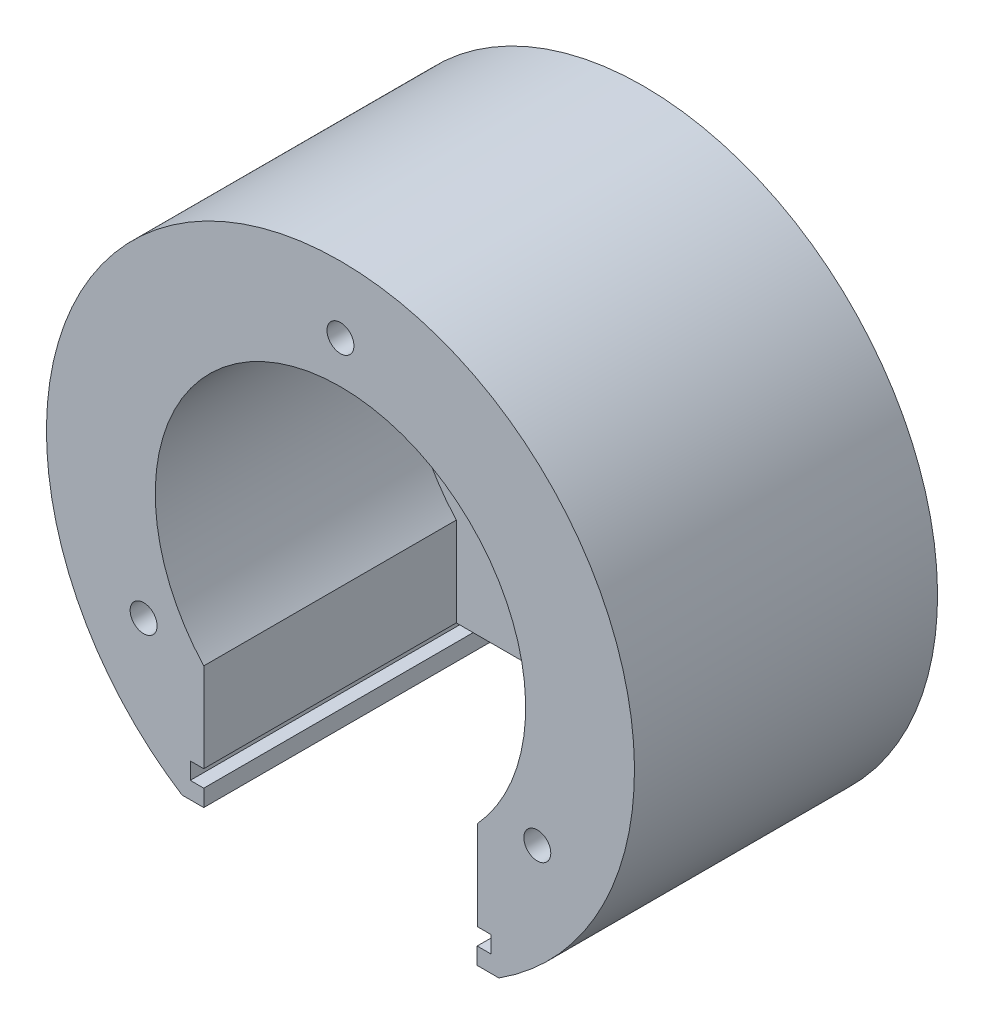
ISO-10303-21;
HEADER;
FILE_DESCRIPTION(('STEP AP214'),'2;1');
FILE_NAME('part.step','',(''),(''),'','','');
FILE_SCHEMA(('AUTOMOTIVE_DESIGN { 1 0 10303 214 1 1 1 1 }'));
ENDSEC;
DATA;
#1=APPLICATION_CONTEXT('core data for automotive mechanical design processes');
#2=APPLICATION_PROTOCOL_DEFINITION('international standard','automotive_design',2000,#1);
#3=PRODUCT_CONTEXT('',#1,'mechanical');
#4=PRODUCT('Part','Part','',(#3));
#5=PRODUCT_RELATED_PRODUCT_CATEGORY('part','',(#4));
#6=PRODUCT_DEFINITION_FORMATION('','',#4);
#7=PRODUCT_DEFINITION_CONTEXT('part definition',#1,'design');
#8=PRODUCT_DEFINITION('design','',#6,#7);
#9=PRODUCT_DEFINITION_SHAPE('','',#8);
#10=(LENGTH_UNIT() NAMED_UNIT(*) SI_UNIT(.MILLI.,.METRE.));
#11=(NAMED_UNIT(*) PLANE_ANGLE_UNIT() SI_UNIT($,.RADIAN.));
#12=(NAMED_UNIT(*) SI_UNIT($,.STERADIAN.) SOLID_ANGLE_UNIT());
#13=UNCERTAINTY_MEASURE_WITH_UNIT(LENGTH_MEASURE(1.E-05),#10,'distance_accuracy_value','');
#14=(GEOMETRIC_REPRESENTATION_CONTEXT(3) GLOBAL_UNCERTAINTY_ASSIGNED_CONTEXT((#13)) GLOBAL_UNIT_ASSIGNED_CONTEXT((#10,
#11,#12)) REPRESENTATION_CONTEXT('',''));
#15=CARTESIAN_POINT('',(0.,0.,0.));
#16=DIRECTION('',(0.,0.,1.));
#17=DIRECTION('',(1.,0.,0.));
#18=AXIS2_PLACEMENT_3D('',#15,#16,#17);
#19=CARTESIAN_POINT('',(0.,0.,18.));
#20=DIRECTION('',(0.,0.,-1.));
#21=DIRECTION('',(-1.,0.,0.));
#22=AXIS2_PLACEMENT_3D('',#19,#20,#21);
#23=CYLINDRICAL_SURFACE('',#22,17.4625);
#24=CARTESIAN_POINT('',(0.,0.,0.));
#25=DIRECTION('',(0.,0.,1.));
#26=DIRECTION('',(1.,0.,0.));
#27=AXIS2_PLACEMENT_3D('',#24,#25,#26);
#28=CIRCLE('',#27,17.4625);
#29=CARTESIAN_POINT('',(9.41035632959772,-14.71,0.));
#30=VERTEX_POINT('',#29);
#31=CARTESIAN_POINT('',(-9.41035632959772,-14.71,0.));
#32=VERTEX_POINT('',#31);
#33=EDGE_CURVE('E152',#30,#32,#28,.T.);
#34=ORIENTED_EDGE('',*,*,#33,.T.);
#35=DIRECTION('',(0.,0.,1.));
#36=VECTOR('',#35,1.);
#37=CARTESIAN_POINT('',(-9.41035632959772,-14.71,0.));
#38=LINE('',#37,#36);
#39=CARTESIAN_POINT('',(-9.41035632959772,-14.71,18.));
#40=VERTEX_POINT('',#39);
#41=EDGE_CURVE('E144',#32,#40,#38,.T.);
#42=ORIENTED_EDGE('',*,*,#41,.T.);
#43=CARTESIAN_POINT('',(0.,0.,18.));
#44=DIRECTION('',(0.,0.,1.));
#45=DIRECTION('',(1.,0.,0.));
#46=AXIS2_PLACEMENT_3D('',#43,#44,#45);
#47=CIRCLE('',#46,17.4625);
#48=CARTESIAN_POINT('',(9.41035632959772,-14.71,18.));
#49=VERTEX_POINT('',#48);
#50=EDGE_CURVE('E154',#49,#40,#47,.T.);
#51=ORIENTED_EDGE('',*,*,#50,.F.);
#52=DIRECTION('',(0.,0.,1.));
#53=VECTOR('',#52,1.);
#54=CARTESIAN_POINT('',(9.41035632959772,-14.71,0.));
#55=LINE('',#54,#53);
#56=EDGE_CURVE('E141',#30,#49,#55,.T.);
#57=ORIENTED_EDGE('',*,*,#56,.F.);
#58=EDGE_LOOP('',(#34,#42,#51,#57));
#59=FACE_BOUND('',#58,.T.);
#60=ADVANCED_FACE('F41',(#59),#23,.T.);
#61=CARTESIAN_POINT('',(0.,0.,18.));
#62=DIRECTION('',(0.,0.,1.));
#63=DIRECTION('',(1.,0.,0.));
#64=AXIS2_PLACEMENT_3D('',#61,#62,#63);
#65=PLANE('',#64);
#66=DIRECTION('',(-1.,0.,0.));
#67=VECTOR('',#66,1.);
#68=CARTESIAN_POINT('',(-9.41035632959772,-14.71,18.));
#69=LINE('',#68,#67);
#70=CARTESIAN_POINT('',(8.11956318098455,-14.71,18.));
#71=VERTEX_POINT('',#70);
#72=EDGE_CURVE('E148',#49,#71,#69,.T.);
#73=ORIENTED_EDGE('',*,*,#72,.F.);
#74=ORIENTED_EDGE('',*,*,#50,.T.);
#75=CARTESIAN_POINT('',(-8.11956318098455,-14.71,18.));
#76=VERTEX_POINT('',#75);
#77=EDGE_CURVE('E565',#76,#40,#69,.T.);
#78=ORIENTED_EDGE('',*,*,#77,.F.);
#79=DIRECTION('',(0.,-1.,0.));
#80=VECTOR('',#79,1.);
#81=CARTESIAN_POINT('',(-8.11956318098455,-13.71,18.));
#82=LINE('',#81,#80);
#83=CARTESIAN_POINT('',(-8.11956318098455,-13.71,18.));
#84=VERTEX_POINT('',#83);
#85=EDGE_CURVE('E518',#84,#76,#82,.T.);
#86=ORIENTED_EDGE('',*,*,#85,.F.);
#87=DIRECTION('',(1.,0.,0.));
#88=VECTOR('',#87,1.);
#89=CARTESIAN_POINT('',(-8.91956318098455,-13.71,18.));
#90=LINE('',#89,#88);
#91=CARTESIAN_POINT('',(-8.91956318098455,-13.71,18.));
#92=VERTEX_POINT('',#91);
#93=EDGE_CURVE('E515',#92,#84,#90,.T.);
#94=ORIENTED_EDGE('',*,*,#93,.F.);
#95=DIRECTION('',(0.,-1.,0.));
#96=VECTOR('',#95,1.);
#97=CARTESIAN_POINT('',(-8.91956318098455,-13.71,18.));
#98=LINE('',#97,#96);
#99=CARTESIAN_POINT('',(-8.91956318098455,-12.71,18.));
#100=VERTEX_POINT('',#99);
#101=EDGE_CURVE('E512',#100,#92,#98,.T.);
#102=ORIENTED_EDGE('',*,*,#101,.F.);
#103=DIRECTION('',(-1.,0.,0.));
#104=VECTOR('',#103,1.);
#105=CARTESIAN_POINT('',(-8.91956318098455,-12.71,18.));
#106=LINE('',#105,#104);
#107=CARTESIAN_POINT('',(-8.11956318098455,-12.71,18.));
#108=VERTEX_POINT('',#107);
#109=EDGE_CURVE('E529',#108,#100,#106,.T.);
#110=ORIENTED_EDGE('',*,*,#109,.F.);
#111=DIRECTION('',(0.,-1.,0.));
#112=VECTOR('',#111,1.);
#113=CARTESIAN_POINT('',(-8.11956318098455,-6.75863679021441,18.));
#114=LINE('',#113,#112);
#115=CARTESIAN_POINT('',(-8.11956318098455,-7.42109788036784,18.));
#116=VERTEX_POINT('',#115);
#117=EDGE_CURVE('E181',#116,#108,#114,.T.);
#118=ORIENTED_EDGE('',*,*,#117,.F.);
#119=CARTESIAN_POINT('',(0.,0.,18.));
#120=DIRECTION('',(0.,0.,1.));
#121=DIRECTION('',(1.,0.,0.));
#122=AXIS2_PLACEMENT_3D('',#119,#120,#121);
#123=CIRCLE('',#122,11.);
#124=CARTESIAN_POINT('',(8.13043681901545,-7.4091832972331,18.));
#125=VERTEX_POINT('',#124);
#126=EDGE_CURVE('E180',#125,#116,#123,.T.);
#127=ORIENTED_EDGE('',*,*,#126,.F.);
#128=DIRECTION('',(0.,1.,0.));
#129=VECTOR('',#128,1.);
#130=CARTESIAN_POINT('',(8.13043681901545,-6.75863679021441,18.));
#131=LINE('',#130,#129);
#132=CARTESIAN_POINT('',(8.13043681901545,-12.71,18.));
#133=VERTEX_POINT('',#132);
#134=EDGE_CURVE('E169',#133,#125,#131,.T.);
#135=ORIENTED_EDGE('',*,*,#134,.F.);
#136=CARTESIAN_POINT('',(8.93043681901545,-12.71,18.));
#137=VERTEX_POINT('',#136);
#138=EDGE_CURVE('E62',#137,#133,#106,.T.);
#139=ORIENTED_EDGE('',*,*,#138,.F.);
#140=DIRECTION('',(0.,1.,0.));
#141=VECTOR('',#140,1.);
#142=CARTESIAN_POINT('',(8.93043681901545,-12.71,18.));
#143=LINE('',#142,#141);
#144=CARTESIAN_POINT('',(8.93043681901545,-13.71,18.));
#145=VERTEX_POINT('',#144);
#146=EDGE_CURVE('E526',#145,#137,#143,.T.);
#147=ORIENTED_EDGE('',*,*,#146,.F.);
#148=DIRECTION('',(1.,0.,0.));
#149=VECTOR('',#148,1.);
#150=CARTESIAN_POINT('',(8.93043681901545,-13.71,18.));
#151=LINE('',#150,#149);
#152=CARTESIAN_POINT('',(8.11956318098455,-13.71,18.));
#153=VERTEX_POINT('',#152);
#154=EDGE_CURVE('E523',#153,#145,#151,.T.);
#155=ORIENTED_EDGE('',*,*,#154,.F.);
#156=DIRECTION('',(0.,1.,0.));
#157=VECTOR('',#156,1.);
#158=CARTESIAN_POINT('',(8.11956318098455,-15.46,18.));
#159=LINE('',#158,#157);
#160=EDGE_CURVE('E521',#71,#153,#159,.T.);
#161=ORIENTED_EDGE('',*,*,#160,.F.);
#162=EDGE_LOOP('',(#73,#74,#78,#86,#94,#102,#110,#118,#127,#135,#139,#147,#155,#161));
#163=FACE_BOUND('',#162,.T.);
#164=CARTESIAN_POINT('',(6.12383107306205E-13,13.5,18.));
#165=DIRECTION('',(0.,0.,1.));
#166=DIRECTION('',(1.,0.,0.));
#167=AXIS2_PLACEMENT_3D('',#164,#165,#166);
#168=CIRCLE('',#167,0.8);
#169=CARTESIAN_POINT('',(0.800000000000613,13.5,18.));
#170=VERTEX_POINT('',#169);
#171=EDGE_CURVE('E161',#170,#170,#168,.T.);
#172=ORIENTED_EDGE('',*,*,#171,.F.);
#173=EDGE_LOOP('',(#172));
#174=FACE_BOUND('',#173,.T.);
#175=CARTESIAN_POINT('',(11.6913429510902,-6.7500000000002,18.));
#176=DIRECTION('',(0.,0.,1.));
#177=DIRECTION('',(1.,0.,0.));
#178=AXIS2_PLACEMENT_3D('',#175,#176,#177);
#179=CIRCLE('',#178,0.800000000000001);
#180=CARTESIAN_POINT('',(12.4913429510902,-6.7500000000002,18.));
#181=VERTEX_POINT('',#180);
#182=EDGE_CURVE('E202',#181,#181,#179,.T.);
#183=ORIENTED_EDGE('',*,*,#182,.F.);
#184=EDGE_LOOP('',(#183));
#185=FACE_BOUND('',#184,.T.);
#186=CARTESIAN_POINT('',(-11.6913429510897,-6.74999999999979,18.));
#187=DIRECTION('',(0.,0.,1.));
#188=DIRECTION('',(1.,0.,0.));
#189=AXIS2_PLACEMENT_3D('',#186,#187,#188);
#190=CIRCLE('',#189,0.800000000000001);
#191=CARTESIAN_POINT('',(-10.8913429510897,-6.74999999999979,18.));
#192=VERTEX_POINT('',#191);
#193=EDGE_CURVE('E208',#192,#192,#190,.T.);
#194=ORIENTED_EDGE('',*,*,#193,.F.);
#195=EDGE_LOOP('',(#194));
#196=FACE_BOUND('',#195,.T.);
#197=ADVANCED_FACE('F175',(#163,#174,#185,#196),#65,.T.);
#198=CARTESIAN_POINT('',(0.,0.,0.));
#199=DIRECTION('',(0.,0.,1.));
#200=DIRECTION('',(1.,0.,0.));
#201=AXIS2_PLACEMENT_3D('',#198,#199,#200);
#202=PLANE('',#201);
#203=ORIENTED_EDGE('',*,*,#33,.F.);
#204=DIRECTION('',(-1.,0.,0.));
#205=VECTOR('',#204,1.);
#206=CARTESIAN_POINT('',(-9.41035632959772,-14.71,0.));
#207=LINE('',#206,#205);
#208=EDGE_CURVE('E138',#30,#32,#207,.T.);
#209=ORIENTED_EDGE('',*,*,#208,.T.);
#210=EDGE_LOOP('',(#203,#209));
#211=FACE_BOUND('',#210,.T.);
#212=ADVANCED_FACE('F156',(#211),#202,.F.);
#213=CARTESIAN_POINT('',(-11.6913429510897,-6.74999999999979,10.7));
#214=DIRECTION('',(0.,0.,1.));
#215=DIRECTION('',(1.,0.,0.));
#216=AXIS2_PLACEMENT_3D('',#213,#214,#215);
#217=CYLINDRICAL_SURFACE('',#216,0.800000000000001);
#218=CARTESIAN_POINT('',(-11.6913429510897,-6.74999999999979,10.7));
#219=DIRECTION('',(0.,0.,1.));
#220=DIRECTION('',(1.,0.,0.));
#221=AXIS2_PLACEMENT_3D('',#218,#219,#220);
#222=CIRCLE('',#221,0.800000000000001);
#223=CARTESIAN_POINT('',(-10.8913429510897,-6.74999999999979,10.7));
#224=VERTEX_POINT('',#223);
#225=EDGE_CURVE('E198',#224,#224,#222,.T.);
#226=ORIENTED_EDGE('',*,*,#225,.F.);
#227=EDGE_LOOP('',(#226));
#228=FACE_BOUND('',#227,.T.);
#229=ORIENTED_EDGE('',*,*,#193,.T.);
#230=EDGE_LOOP('',(#229));
#231=FACE_BOUND('',#230,.T.);
#232=ADVANCED_FACE('F215',(#228,#231),#217,.F.);
#233=CARTESIAN_POINT('',(-11.6913429510897,-6.74999999999979,10.7));
#234=DIRECTION('',(0.,0.,1.));
#235=DIRECTION('',(1.,0.,0.));
#236=AXIS2_PLACEMENT_3D('',#233,#234,#235);
#237=PLANE('',#236);
#238=ORIENTED_EDGE('',*,*,#225,.T.);
#239=EDGE_LOOP('',(#238));
#240=FACE_BOUND('',#239,.T.);
#241=ADVANCED_FACE('F213',(#240),#237,.T.);
#242=CARTESIAN_POINT('',(11.6913429510902,-6.7500000000002,10.7));
#243=DIRECTION('',(0.,0.,1.));
#244=DIRECTION('',(1.,0.,0.));
#245=AXIS2_PLACEMENT_3D('',#242,#243,#244);
#246=CYLINDRICAL_SURFACE('',#245,0.800000000000001);
#247=CARTESIAN_POINT('',(11.6913429510902,-6.7500000000002,10.7));
#248=DIRECTION('',(0.,0.,1.));
#249=DIRECTION('',(1.,0.,0.));
#250=AXIS2_PLACEMENT_3D('',#247,#248,#249);
#251=CIRCLE('',#250,0.800000000000001);
#252=CARTESIAN_POINT('',(12.4913429510902,-6.7500000000002,10.7));
#253=VERTEX_POINT('',#252);
#254=EDGE_CURVE('E205',#253,#253,#251,.T.);
#255=ORIENTED_EDGE('',*,*,#254,.F.);
#256=EDGE_LOOP('',(#255));
#257=FACE_BOUND('',#256,.T.);
#258=ORIENTED_EDGE('',*,*,#182,.T.);
#259=EDGE_LOOP('',(#258));
#260=FACE_BOUND('',#259,.T.);
#261=ADVANCED_FACE('F229',(#257,#260),#246,.F.);
#262=CARTESIAN_POINT('',(11.6913429510902,-6.7500000000002,10.7));
#263=DIRECTION('',(0.,0.,1.));
#264=DIRECTION('',(1.,0.,0.));
#265=AXIS2_PLACEMENT_3D('',#262,#263,#264);
#266=PLANE('',#265);
#267=ORIENTED_EDGE('',*,*,#254,.T.);
#268=EDGE_LOOP('',(#267));
#269=FACE_BOUND('',#268,.T.);
#270=ADVANCED_FACE('F231',(#269),#266,.T.);
#271=CARTESIAN_POINT('',(6.12383107306205E-13,13.5,10.7));
#272=DIRECTION('',(0.,0.,1.));
#273=DIRECTION('',(1.,0.,0.));
#274=AXIS2_PLACEMENT_3D('',#271,#272,#273);
#275=CYLINDRICAL_SURFACE('',#274,0.8);
#276=CARTESIAN_POINT('',(6.12383107306205E-13,13.5,10.7));
#277=DIRECTION('',(0.,0.,1.));
#278=DIRECTION('',(1.,0.,0.));
#279=AXIS2_PLACEMENT_3D('',#276,#277,#278);
#280=CIRCLE('',#279,0.8);
#281=CARTESIAN_POINT('',(0.800000000000613,13.5,10.7));
#282=VERTEX_POINT('',#281);
#283=EDGE_CURVE('E157',#282,#282,#280,.T.);
#284=ORIENTED_EDGE('',*,*,#283,.F.);
#285=EDGE_LOOP('',(#284));
#286=FACE_BOUND('',#285,.T.);
#287=ORIENTED_EDGE('',*,*,#171,.T.);
#288=EDGE_LOOP('',(#287));
#289=FACE_BOUND('',#288,.T.);
#290=ADVANCED_FACE('F234',(#286,#289),#275,.F.);
#291=CARTESIAN_POINT('',(6.12383107306205E-13,13.5,10.7));
#292=DIRECTION('',(0.,0.,1.));
#293=DIRECTION('',(1.,0.,0.));
#294=AXIS2_PLACEMENT_3D('',#291,#292,#293);
#295=PLANE('',#294);
#296=ORIENTED_EDGE('',*,*,#283,.T.);
#297=EDGE_LOOP('',(#296));
#298=FACE_BOUND('',#297,.T.);
#299=ADVANCED_FACE('F241',(#298),#295,.T.);
#300=CARTESIAN_POINT('',(0.,0.,3.));
#301=DIRECTION('',(0.,0.,1.));
#302=DIRECTION('',(1.,0.,0.));
#303=AXIS2_PLACEMENT_3D('',#300,#301,#302);
#304=CYLINDRICAL_SURFACE('',#303,11.);
#305=ORIENTED_EDGE('',*,*,#126,.T.);
#306=DIRECTION('',(0.,0.,1.));
#307=VECTOR('',#306,1.);
#308=CARTESIAN_POINT('',(-8.11956318098455,-7.42109788036784,3.));
#309=LINE('',#308,#307);
#310=CARTESIAN_POINT('',(-8.11956318098455,-7.42109788036784,3.));
#311=VERTEX_POINT('',#310);
#312=EDGE_CURVE('E192',#116,#311,#309,.F.);
#313=ORIENTED_EDGE('',*,*,#312,.T.);
#314=CARTESIAN_POINT('',(0.,0.,3.));
#315=DIRECTION('',(0.,0.,1.));
#316=DIRECTION('',(1.,0.,0.));
#317=AXIS2_PLACEMENT_3D('',#314,#315,#316);
#318=CIRCLE('',#317,11.);
#319=CARTESIAN_POINT('',(8.13043681901545,-7.4091832972331,3.));
#320=VERTEX_POINT('',#319);
#321=EDGE_CURVE('E195',#320,#311,#318,.T.);
#322=ORIENTED_EDGE('',*,*,#321,.F.);
#323=DIRECTION('',(0.,0.,1.));
#324=VECTOR('',#323,1.);
#325=CARTESIAN_POINT('',(8.13043681901545,-7.4091832972331,3.));
#326=LINE('',#325,#324);
#327=EDGE_CURVE('E190',#320,#125,#326,.T.);
#328=ORIENTED_EDGE('',*,*,#327,.T.);
#329=EDGE_LOOP('',(#305,#313,#322,#328));
#330=FACE_BOUND('',#329,.T.);
#331=ADVANCED_FACE('F245',(#330),#304,.F.);
#332=CARTESIAN_POINT('',(0.,0.,3.));
#333=DIRECTION('',(0.,0.,1.));
#334=DIRECTION('',(1.,0.,0.));
#335=AXIS2_PLACEMENT_3D('',#332,#333,#334);
#336=PLANE('',#335);
#337=DIRECTION('',(-1.,0.,0.));
#338=VECTOR('',#337,1.);
#339=CARTESIAN_POINT('',(0.,-12.71,3.));
#340=LINE('',#339,#338);
#341=CARTESIAN_POINT('',(8.13043681901545,-12.71,3.));
#342=VERTEX_POINT('',#341);
#343=CARTESIAN_POINT('',(-8.11956318098455,-12.71,3.));
#344=VERTEX_POINT('',#343);
#345=EDGE_CURVE('E534',#342,#344,#340,.T.);
#346=ORIENTED_EDGE('',*,*,#345,.F.);
#347=DIRECTION('',(0.,-1.,0.));
#348=VECTOR('',#347,1.);
#349=CARTESIAN_POINT('',(8.13043681901545,-6.75863679021441,3.));
#350=LINE('',#349,#348);
#351=EDGE_CURVE('E171',#320,#342,#350,.T.);
#352=ORIENTED_EDGE('',*,*,#351,.F.);
#353=ORIENTED_EDGE('',*,*,#321,.T.);
#354=DIRECTION('',(0.,1.,0.));
#355=VECTOR('',#354,1.);
#356=CARTESIAN_POINT('',(-8.11956318098455,-6.75863679021441,3.));
#357=LINE('',#356,#355);
#358=EDGE_CURVE('E183',#344,#311,#357,.T.);
#359=ORIENTED_EDGE('',*,*,#358,.F.);
#360=EDGE_LOOP('',(#346,#352,#353,#359));
#361=FACE_BOUND('',#360,.T.);
#362=ADVANCED_FACE('F249',(#361),#336,.T.);
#363=CARTESIAN_POINT('',(-8.11956318098455,-6.75863679021441,-14.5775643611243));
#364=DIRECTION('',(-1.,0.,0.));
#365=DIRECTION('',(0.,-1.,0.));
#366=AXIS2_PLACEMENT_3D('',#363,#364,#365);
#367=PLANE('',#366);
#368=ORIENTED_EDGE('',*,*,#117,.T.);
#369=DIRECTION('',(0.,0.,-1.));
#370=VECTOR('',#369,1.);
#371=CARTESIAN_POINT('',(-8.11956318098455,-12.71,-14.5775643611243));
#372=LINE('',#371,#370);
#373=EDGE_CURVE('E186',#108,#344,#372,.T.);
#374=ORIENTED_EDGE('',*,*,#373,.T.);
#375=ORIENTED_EDGE('',*,*,#358,.T.);
#376=ORIENTED_EDGE('',*,*,#312,.F.);
#377=EDGE_LOOP('',(#368,#374,#375,#376));
#378=FACE_BOUND('',#377,.T.);
#379=ADVANCED_FACE('F253',(#378),#367,.F.);
#380=CARTESIAN_POINT('',(8.13043681901545,-6.75863679021441,-14.5775643611243));
#381=DIRECTION('',(1.,0.,0.));
#382=DIRECTION('',(0.,1.,0.));
#383=AXIS2_PLACEMENT_3D('',#380,#381,#382);
#384=PLANE('',#383);
#385=ORIENTED_EDGE('',*,*,#351,.T.);
#386=DIRECTION('',(0.,0.,1.));
#387=VECTOR('',#386,1.);
#388=CARTESIAN_POINT('',(8.13043681901545,-12.71,-14.5775643611243));
#389=LINE('',#388,#387);
#390=EDGE_CURVE('E48',#342,#133,#389,.T.);
#391=ORIENTED_EDGE('',*,*,#390,.T.);
#392=ORIENTED_EDGE('',*,*,#134,.T.);
#393=ORIENTED_EDGE('',*,*,#327,.F.);
#394=EDGE_LOOP('',(#385,#391,#392,#393));
#395=FACE_BOUND('',#394,.T.);
#396=ADVANCED_FACE('F167',(#395),#384,.F.);
#397=CARTESIAN_POINT('',(-8.91956318098455,-12.71,0.999999999999997));
#398=DIRECTION('',(0.,1.,0.));
#399=DIRECTION('',(0.,0.,1.));
#400=AXIS2_PLACEMENT_3D('',#397,#398,#399);
#401=PLANE('',#400);
#402=ORIENTED_EDGE('',*,*,#109,.T.);
#403=DIRECTION('',(0.,0.,1.));
#404=VECTOR('',#403,1.);
#405=CARTESIAN_POINT('',(-8.91956318098455,-12.71,0.999999999999997));
#406=LINE('',#405,#404);
#407=CARTESIAN_POINT('',(-8.91956318098455,-12.71,0.999999999999997));
#408=VERTEX_POINT('',#407);
#409=EDGE_CURVE('E531',#408,#100,#406,.T.);
#410=ORIENTED_EDGE('',*,*,#409,.F.);
#411=DIRECTION('',(-1.,0.,0.));
#412=VECTOR('',#411,1.);
#413=CARTESIAN_POINT('',(-8.91956318098455,-12.71,0.999999999999997));
#414=LINE('',#413,#412);
#415=CARTESIAN_POINT('',(8.93043681901545,-12.71,0.999999999999997));
#416=VERTEX_POINT('',#415);
#417=EDGE_CURVE('E508',#416,#408,#414,.T.);
#418=ORIENTED_EDGE('',*,*,#417,.F.);
#419=DIRECTION('',(0.,0.,1.));
#420=VECTOR('',#419,1.);
#421=CARTESIAN_POINT('',(8.93043681901545,-12.71,0.999999999999997));
#422=LINE('',#421,#420);
#423=EDGE_CURVE('E535',#416,#137,#422,.T.);
#424=ORIENTED_EDGE('',*,*,#423,.T.);
#425=ORIENTED_EDGE('',*,*,#138,.T.);
#426=ORIENTED_EDGE('',*,*,#390,.F.);
#427=ORIENTED_EDGE('',*,*,#345,.T.);
#428=ORIENTED_EDGE('',*,*,#373,.F.);
#429=EDGE_LOOP('',(#402,#410,#418,#424,#425,#426,#427,#428));
#430=FACE_BOUND('',#429,.T.);
#431=ADVANCED_FACE('F260',(#430),#401,.F.);
#432=CARTESIAN_POINT('',(-8.91956318098455,-13.71,0.999999999999997));
#433=DIRECTION('',(-1.,0.,0.));
#434=DIRECTION('',(0.,0.,1.));
#435=AXIS2_PLACEMENT_3D('',#432,#433,#434);
#436=PLANE('',#435);
#437=ORIENTED_EDGE('',*,*,#101,.T.);
#438=DIRECTION('',(0.,0.,1.));
#439=VECTOR('',#438,1.);
#440=CARTESIAN_POINT('',(-8.91956318098455,-13.71,0.999999999999997));
#441=LINE('',#440,#439);
#442=CARTESIAN_POINT('',(-8.91956318098455,-13.71,0.999999999999997));
#443=VERTEX_POINT('',#442);
#444=EDGE_CURVE('E511',#443,#92,#441,.T.);
#445=ORIENTED_EDGE('',*,*,#444,.F.);
#446=DIRECTION('',(0.,-1.,0.));
#447=VECTOR('',#446,1.);
#448=CARTESIAN_POINT('',(-8.91956318098455,-13.71,0.999999999999997));
#449=LINE('',#448,#447);
#450=EDGE_CURVE('E499',#408,#443,#449,.T.);
#451=ORIENTED_EDGE('',*,*,#450,.F.);
#452=ORIENTED_EDGE('',*,*,#409,.T.);
#453=EDGE_LOOP('',(#437,#445,#451,#452));
#454=FACE_BOUND('',#453,.T.);
#455=ADVANCED_FACE('F261',(#454),#436,.F.);
#456=CARTESIAN_POINT('',(8.93043681901545,-12.71,0.999999999999997));
#457=DIRECTION('',(1.,0.,0.));
#458=DIRECTION('',(0.,0.,-1.));
#459=AXIS2_PLACEMENT_3D('',#456,#457,#458);
#460=PLANE('',#459);
#461=ORIENTED_EDGE('',*,*,#146,.T.);
#462=ORIENTED_EDGE('',*,*,#423,.F.);
#463=DIRECTION('',(0.,1.,0.));
#464=VECTOR('',#463,1.);
#465=CARTESIAN_POINT('',(8.93043681901545,-12.71,0.999999999999997));
#466=LINE('',#465,#464);
#467=CARTESIAN_POINT('',(8.93043681901545,-13.71,0.999999999999997));
#468=VERTEX_POINT('',#467);
#469=EDGE_CURVE('E505',#468,#416,#466,.T.);
#470=ORIENTED_EDGE('',*,*,#469,.F.);
#471=DIRECTION('',(0.,0.,1.));
#472=VECTOR('',#471,1.);
#473=CARTESIAN_POINT('',(8.93043681901545,-13.71,0.999999999999997));
#474=LINE('',#473,#472);
#475=EDGE_CURVE('E537',#468,#145,#474,.T.);
#476=ORIENTED_EDGE('',*,*,#475,.T.);
#477=EDGE_LOOP('',(#461,#462,#470,#476));
#478=FACE_BOUND('',#477,.T.);
#479=ADVANCED_FACE('F264',(#478),#460,.F.);
#480=CARTESIAN_POINT('',(8.93043681901545,-13.71,0.999999999999997));
#481=DIRECTION('',(0.,-1.,0.));
#482=DIRECTION('',(0.,0.,-1.));
#483=AXIS2_PLACEMENT_3D('',#480,#481,#482);
#484=PLANE('',#483);
#485=ORIENTED_EDGE('',*,*,#154,.T.);
#486=ORIENTED_EDGE('',*,*,#475,.F.);
#487=DIRECTION('',(1.,0.,0.));
#488=VECTOR('',#487,1.);
#489=CARTESIAN_POINT('',(8.93043681901545,-13.71,0.999999999999997));
#490=LINE('',#489,#488);
#491=CARTESIAN_POINT('',(8.11956318098455,-13.71,0.999999999999997));
#492=VERTEX_POINT('',#491);
#493=EDGE_CURVE('E497',#492,#468,#490,.T.);
#494=ORIENTED_EDGE('',*,*,#493,.F.);
#495=DIRECTION('',(0.,0.,1.));
#496=VECTOR('',#495,1.);
#497=CARTESIAN_POINT('',(8.11956318098455,-13.71,0.999999999999997));
#498=LINE('',#497,#496);
#499=EDGE_CURVE('E539',#492,#153,#498,.T.);
#500=ORIENTED_EDGE('',*,*,#499,.T.);
#501=EDGE_LOOP('',(#485,#486,#494,#500));
#502=FACE_BOUND('',#501,.T.);
#503=ADVANCED_FACE('F278',(#502),#484,.F.);
#504=CARTESIAN_POINT('',(8.11956318098455,-15.46,0.999999999999997));
#505=DIRECTION('',(1.,0.,0.));
#506=DIRECTION('',(0.,0.,-1.));
#507=AXIS2_PLACEMENT_3D('',#504,#505,#506);
#508=PLANE('',#507);
#509=DIRECTION('',(0.,1.,0.));
#510=VECTOR('',#509,1.);
#511=CARTESIAN_POINT('',(8.11956318098455,-15.46,0.999999999999997));
#512=LINE('',#511,#510);
#513=CARTESIAN_POINT('',(8.11956318098455,-14.71,0.999999999999997));
#514=VERTEX_POINT('',#513);
#515=EDGE_CURVE('E495',#514,#492,#512,.T.);
#516=ORIENTED_EDGE('',*,*,#515,.F.);
#517=DIRECTION('',(0.,0.,1.));
#518=VECTOR('',#517,1.);
#519=CARTESIAN_POINT('',(8.11956318098455,-14.71,0.999999999999997));
#520=LINE('',#519,#518);
#521=EDGE_CURVE('E55',#514,#71,#520,.T.);
#522=ORIENTED_EDGE('',*,*,#521,.T.);
#523=ORIENTED_EDGE('',*,*,#160,.T.);
#524=ORIENTED_EDGE('',*,*,#499,.F.);
#525=EDGE_LOOP('',(#516,#522,#523,#524));
#526=FACE_BOUND('',#525,.T.);
#527=ADVANCED_FACE('F274',(#526),#508,.F.);
#528=CARTESIAN_POINT('',(-8.11956318098455,-13.71,0.999999999999997));
#529=DIRECTION('',(-1.,0.,0.));
#530=DIRECTION('',(0.,0.,1.));
#531=AXIS2_PLACEMENT_3D('',#528,#529,#530);
#532=PLANE('',#531);
#533=ORIENTED_EDGE('',*,*,#85,.T.);
#534=DIRECTION('',(0.,0.,-1.));
#535=VECTOR('',#534,1.);
#536=CARTESIAN_POINT('',(-8.11956318098455,-14.71,0.999999999999997));
#537=LINE('',#536,#535);
#538=CARTESIAN_POINT('',(-8.11956318098455,-14.71,0.999999999999997));
#539=VERTEX_POINT('',#538);
#540=EDGE_CURVE('E560',#76,#539,#537,.T.);
#541=ORIENTED_EDGE('',*,*,#540,.T.);
#542=DIRECTION('',(0.,-1.,0.));
#543=VECTOR('',#542,1.);
#544=CARTESIAN_POINT('',(-8.11956318098455,-13.71,0.999999999999997));
#545=LINE('',#544,#543);
#546=CARTESIAN_POINT('',(-8.11956318098455,-13.71,0.999999999999997));
#547=VERTEX_POINT('',#546);
#548=EDGE_CURVE('E489',#547,#539,#545,.T.);
#549=ORIENTED_EDGE('',*,*,#548,.F.);
#550=DIRECTION('',(0.,0.,1.));
#551=VECTOR('',#550,1.);
#552=CARTESIAN_POINT('',(-8.11956318098455,-13.71,0.999999999999997));
#553=LINE('',#552,#551);
#554=EDGE_CURVE('E542',#547,#84,#553,.T.);
#555=ORIENTED_EDGE('',*,*,#554,.T.);
#556=EDGE_LOOP('',(#533,#541,#549,#555));
#557=FACE_BOUND('',#556,.T.);
#558=ADVANCED_FACE('F270',(#557),#532,.F.);
#559=CARTESIAN_POINT('',(-8.91956318098455,-13.71,0.999999999999997));
#560=DIRECTION('',(0.,-1.,0.));
#561=DIRECTION('',(0.,0.,-1.));
#562=AXIS2_PLACEMENT_3D('',#559,#560,#561);
#563=PLANE('',#562);
#564=ORIENTED_EDGE('',*,*,#93,.T.);
#565=ORIENTED_EDGE('',*,*,#554,.F.);
#566=DIRECTION('',(1.,0.,0.));
#567=VECTOR('',#566,1.);
#568=CARTESIAN_POINT('',(-8.91956318098455,-13.71,0.999999999999997));
#569=LINE('',#568,#567);
#570=EDGE_CURVE('E493',#443,#547,#569,.T.);
#571=ORIENTED_EDGE('',*,*,#570,.F.);
#572=ORIENTED_EDGE('',*,*,#444,.T.);
#573=EDGE_LOOP('',(#564,#565,#571,#572));
#574=FACE_BOUND('',#573,.T.);
#575=ADVANCED_FACE('F266',(#574),#563,.F.);
#576=CARTESIAN_POINT('',(0.,0.,0.999999999999997));
#577=DIRECTION('',(0.,0.,-1.));
#578=DIRECTION('',(-1.,0.,0.));
#579=AXIS2_PLACEMENT_3D('',#576,#577,#578);
#580=PLANE('',#579);
#581=ORIENTED_EDGE('',*,*,#548,.T.);
#582=DIRECTION('',(1.,0.,0.));
#583=VECTOR('',#582,1.);
#584=CARTESIAN_POINT('',(0.,-14.71,0.999999999999997));
#585=LINE('',#584,#583);
#586=EDGE_CURVE('E11',#539,#514,#585,.T.);
#587=ORIENTED_EDGE('',*,*,#586,.T.);
#588=ORIENTED_EDGE('',*,*,#515,.T.);
#589=ORIENTED_EDGE('',*,*,#493,.T.);
#590=ORIENTED_EDGE('',*,*,#469,.T.);
#591=ORIENTED_EDGE('',*,*,#417,.T.);
#592=ORIENTED_EDGE('',*,*,#450,.T.);
#593=ORIENTED_EDGE('',*,*,#570,.T.);
#594=EDGE_LOOP('',(#581,#587,#588,#589,#590,#591,#592,#593));
#595=FACE_BOUND('',#594,.T.);
#596=ADVANCED_FACE('F269',(#595),#580,.F.);
#597=CARTESIAN_POINT('',(-9.41035632959772,-14.71,0.));
#598=DIRECTION('',(0.,1.,0.));
#599=DIRECTION('',(0.,0.,1.));
#600=AXIS2_PLACEMENT_3D('',#597,#598,#599);
#601=PLANE('',#600);
#602=ORIENTED_EDGE('',*,*,#586,.F.);
#603=ORIENTED_EDGE('',*,*,#540,.F.);
#604=ORIENTED_EDGE('',*,*,#77,.T.);
#605=ORIENTED_EDGE('',*,*,#41,.F.);
#606=ORIENTED_EDGE('',*,*,#208,.F.);
#607=ORIENTED_EDGE('',*,*,#56,.T.);
#608=ORIENTED_EDGE('',*,*,#72,.T.);
#609=ORIENTED_EDGE('',*,*,#521,.F.);
#610=EDGE_LOOP('',(#602,#603,#604,#605,#606,#607,#608,#609));
#611=FACE_BOUND('',#610,.T.);
#612=ADVANCED_FACE('F140',(#611),#601,.F.);
#613=CLOSED_SHELL('',(#60,#197,#212,#232,#241,#261,#270,#290,#299,#331,#362,#379,#396,#431,#455,
#479,#503,#527,#558,#575,#596,#612));
#614=MANIFOLD_SOLID_BREP('B2',#613);
#615=ADVANCED_BREP_SHAPE_REPRESENTATION('',(#18,#614),#14);
#616=SHAPE_DEFINITION_REPRESENTATION(#9,#615);
ENDSEC;
END-ISO-10303-21;
